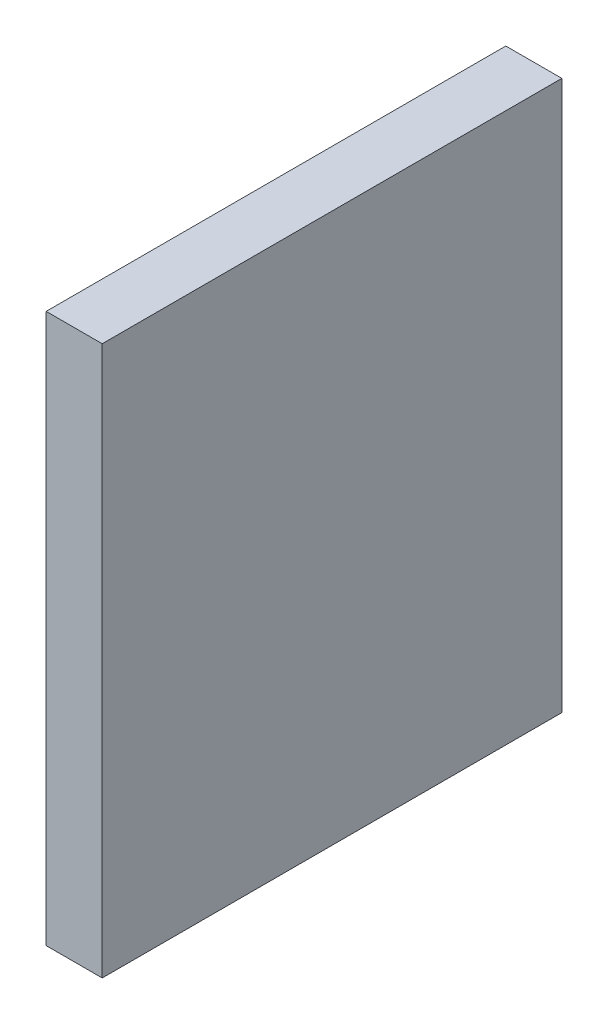
ISO-10303-21;
HEADER;
FILE_DESCRIPTION(('STEP AP214'),'2;1');
FILE_NAME('part.step','',(''),(''),'','','');
FILE_SCHEMA(('AUTOMOTIVE_DESIGN { 1 0 10303 214 1 1 1 1 }'));
ENDSEC;
DATA;
#1=APPLICATION_CONTEXT('core data for automotive mechanical design processes');
#2=APPLICATION_PROTOCOL_DEFINITION('international standard','automotive_design',2000,#1);
#3=PRODUCT_CONTEXT('',#1,'mechanical');
#4=PRODUCT('Part','Part','',(#3));
#5=PRODUCT_RELATED_PRODUCT_CATEGORY('part','',(#4));
#6=PRODUCT_DEFINITION_FORMATION('','',#4);
#7=PRODUCT_DEFINITION_CONTEXT('part definition',#1,'design');
#8=PRODUCT_DEFINITION('design','',#6,#7);
#9=PRODUCT_DEFINITION_SHAPE('','',#8);
#10=(LENGTH_UNIT() NAMED_UNIT(*) SI_UNIT(.MILLI.,.METRE.));
#11=(NAMED_UNIT(*) PLANE_ANGLE_UNIT() SI_UNIT($,.RADIAN.));
#12=(NAMED_UNIT(*) SI_UNIT($,.STERADIAN.) SOLID_ANGLE_UNIT());
#13=UNCERTAINTY_MEASURE_WITH_UNIT(LENGTH_MEASURE(1.E-05),#10,'distance_accuracy_value','');
#14=(GEOMETRIC_REPRESENTATION_CONTEXT(3) GLOBAL_UNCERTAINTY_ASSIGNED_CONTEXT((#13)) GLOBAL_UNIT_ASSIGNED_CONTEXT((#10,
#11,#12)) REPRESENTATION_CONTEXT('',''));
#15=CARTESIAN_POINT('',(0.,0.,0.));
#16=DIRECTION('',(0.,0.,1.));
#17=DIRECTION('',(1.,0.,0.));
#18=AXIS2_PLACEMENT_3D('',#15,#16,#17);
#19=CARTESIAN_POINT('',(2.5,0.,0.));
#20=DIRECTION('',(0.,0.,1.));
#21=DIRECTION('',(1.,0.,0.));
#22=AXIS2_PLACEMENT_3D('',#19,#20,#21);
#23=PLANE('',#22);
#24=DIRECTION('',(0.,1.,0.));
#25=VECTOR('',#24,1.);
#26=CARTESIAN_POINT('',(0.,0.,0.));
#27=LINE('',#26,#25);
#28=CARTESIAN_POINT('',(0.,0.,0.));
#29=VERTEX_POINT('',#28);
#30=CARTESIAN_POINT('',(0.,24.5,0.));
#31=VERTEX_POINT('',#30);
#32=EDGE_CURVE('E96',#29,#31,#27,.T.);
#33=ORIENTED_EDGE('',*,*,#32,.T.);
#34=DIRECTION('',(-1.,0.,0.));
#35=VECTOR('',#34,1.);
#36=CARTESIAN_POINT('',(2.5,24.5,0.));
#37=LINE('',#36,#35);
#38=CARTESIAN_POINT('',(2.5,24.5,0.));
#39=VERTEX_POINT('',#38);
#40=EDGE_CURVE('E11',#39,#31,#37,.T.);
#41=ORIENTED_EDGE('',*,*,#40,.F.);
#42=DIRECTION('',(0.,1.,0.));
#43=VECTOR('',#42,1.);
#44=CARTESIAN_POINT('',(2.5,0.,0.));
#45=LINE('',#44,#43);
#46=CARTESIAN_POINT('',(2.5,0.,0.));
#47=VERTEX_POINT('',#46);
#48=EDGE_CURVE('E84',#47,#39,#45,.T.);
#49=ORIENTED_EDGE('',*,*,#48,.F.);
#50=DIRECTION('',(-1.,0.,0.));
#51=VECTOR('',#50,1.);
#52=CARTESIAN_POINT('',(2.5,0.,0.));
#53=LINE('',#52,#51);
#54=EDGE_CURVE('E92',#47,#29,#53,.T.);
#55=ORIENTED_EDGE('',*,*,#54,.T.);
#56=EDGE_LOOP('',(#33,#41,#49,#55));
#57=FACE_BOUND('',#56,.T.);
#58=ADVANCED_FACE('F33',(#57),#23,.F.);
#59=CARTESIAN_POINT('',(2.5,24.5,0.));
#60=DIRECTION('',(0.,-1.,0.));
#61=DIRECTION('',(0.,0.,-1.));
#62=AXIS2_PLACEMENT_3D('',#59,#60,#61);
#63=PLANE('',#62);
#64=DIRECTION('',(0.,0.,1.));
#65=VECTOR('',#64,1.);
#66=CARTESIAN_POINT('',(0.,24.5,0.));
#67=LINE('',#66,#65);
#68=CARTESIAN_POINT('',(0.,24.5,20.5));
#69=VERTEX_POINT('',#68);
#70=EDGE_CURVE('E88',#31,#69,#67,.T.);
#71=ORIENTED_EDGE('',*,*,#70,.T.);
#72=DIRECTION('',(-1.,0.,0.));
#73=VECTOR('',#72,1.);
#74=CARTESIAN_POINT('',(2.5,24.5,20.5));
#75=LINE('',#74,#73);
#76=CARTESIAN_POINT('',(2.5,24.5,20.5));
#77=VERTEX_POINT('',#76);
#78=EDGE_CURVE('E41',#77,#69,#75,.T.);
#79=ORIENTED_EDGE('',*,*,#78,.F.);
#80=DIRECTION('',(0.,0.,1.));
#81=VECTOR('',#80,1.);
#82=CARTESIAN_POINT('',(2.5,24.5,0.));
#83=LINE('',#82,#81);
#84=EDGE_CURVE('E79',#39,#77,#83,.T.);
#85=ORIENTED_EDGE('',*,*,#84,.F.);
#86=ORIENTED_EDGE('',*,*,#40,.T.);
#87=EDGE_LOOP('',(#71,#79,#85,#86));
#88=FACE_BOUND('',#87,.T.);
#89=ADVANCED_FACE('F87',(#88),#63,.F.);
#90=CARTESIAN_POINT('',(2.5,0.,20.5));
#91=DIRECTION('',(0.,0.,-1.));
#92=DIRECTION('',(-1.,0.,0.));
#93=AXIS2_PLACEMENT_3D('',#90,#91,#92);
#94=PLANE('',#93);
#95=DIRECTION('',(0.,-1.,0.));
#96=VECTOR('',#95,1.);
#97=CARTESIAN_POINT('',(0.,0.,20.5));
#98=LINE('',#97,#96);
#99=CARTESIAN_POINT('',(0.,0.,20.5));
#100=VERTEX_POINT('',#99);
#101=EDGE_CURVE('E66',#69,#100,#98,.T.);
#102=ORIENTED_EDGE('',*,*,#101,.T.);
#103=DIRECTION('',(-1.,0.,0.));
#104=VECTOR('',#103,1.);
#105=CARTESIAN_POINT('',(2.5,0.,20.5));
#106=LINE('',#105,#104);
#107=CARTESIAN_POINT('',(2.5,0.,20.5));
#108=VERTEX_POINT('',#107);
#109=EDGE_CURVE('E89',#108,#100,#106,.T.);
#110=ORIENTED_EDGE('',*,*,#109,.F.);
#111=DIRECTION('',(0.,-1.,0.));
#112=VECTOR('',#111,1.);
#113=CARTESIAN_POINT('',(2.5,0.,20.5));
#114=LINE('',#113,#112);
#115=EDGE_CURVE('E82',#77,#108,#114,.T.);
#116=ORIENTED_EDGE('',*,*,#115,.F.);
#117=ORIENTED_EDGE('',*,*,#78,.T.);
#118=EDGE_LOOP('',(#102,#110,#116,#117));
#119=FACE_BOUND('',#118,.T.);
#120=ADVANCED_FACE('F90',(#119),#94,.F.);
#121=CARTESIAN_POINT('',(2.5,0.,0.));
#122=DIRECTION('',(0.,1.,0.));
#123=DIRECTION('',(0.,0.,1.));
#124=AXIS2_PLACEMENT_3D('',#121,#122,#123);
#125=PLANE('',#124);
#126=DIRECTION('',(0.,0.,-1.));
#127=VECTOR('',#126,1.);
#128=CARTESIAN_POINT('',(0.,0.,0.));
#129=LINE('',#128,#127);
#130=EDGE_CURVE('E72',#100,#29,#129,.T.);
#131=ORIENTED_EDGE('',*,*,#130,.T.);
#132=ORIENTED_EDGE('',*,*,#54,.F.);
#133=DIRECTION('',(0.,0.,-1.));
#134=VECTOR('',#133,1.);
#135=CARTESIAN_POINT('',(2.5,0.,0.));
#136=LINE('',#135,#134);
#137=EDGE_CURVE('E49',#108,#47,#136,.T.);
#138=ORIENTED_EDGE('',*,*,#137,.F.);
#139=ORIENTED_EDGE('',*,*,#109,.T.);
#140=EDGE_LOOP('',(#131,#132,#138,#139));
#141=FACE_BOUND('',#140,.T.);
#142=ADVANCED_FACE('F103',(#141),#125,.F.);
#143=CARTESIAN_POINT('',(2.5,0.,0.));
#144=DIRECTION('',(1.,0.,0.));
#145=DIRECTION('',(0.,0.,-1.));
#146=AXIS2_PLACEMENT_3D('',#143,#144,#145);
#147=PLANE('',#146);
#148=ORIENTED_EDGE('',*,*,#48,.T.);
#149=ORIENTED_EDGE('',*,*,#84,.T.);
#150=ORIENTED_EDGE('',*,*,#115,.T.);
#151=ORIENTED_EDGE('',*,*,#137,.T.);
#152=EDGE_LOOP('',(#148,#149,#150,#151));
#153=FACE_BOUND('',#152,.T.);
#154=ADVANCED_FACE('F80',(#153),#147,.T.);
#155=CARTESIAN_POINT('',(0.,0.,0.));
#156=DIRECTION('',(1.,0.,0.));
#157=DIRECTION('',(0.,0.,-1.));
#158=AXIS2_PLACEMENT_3D('',#155,#156,#157);
#159=PLANE('',#158);
#160=ORIENTED_EDGE('',*,*,#32,.F.);
#161=ORIENTED_EDGE('',*,*,#130,.F.);
#162=ORIENTED_EDGE('',*,*,#101,.F.);
#163=ORIENTED_EDGE('',*,*,#70,.F.);
#164=EDGE_LOOP('',(#160,#161,#162,#163));
#165=FACE_BOUND('',#164,.T.);
#166=ADVANCED_FACE('F106',(#165),#159,.F.);
#167=CLOSED_SHELL('',(#58,#89,#120,#142,#154,#166));
#168=MANIFOLD_SOLID_BREP('B2',#167);
#169=ADVANCED_BREP_SHAPE_REPRESENTATION('',(#18,#168),#14);
#170=SHAPE_DEFINITION_REPRESENTATION(#9,#169);
ENDSEC;
END-ISO-10303-21;
